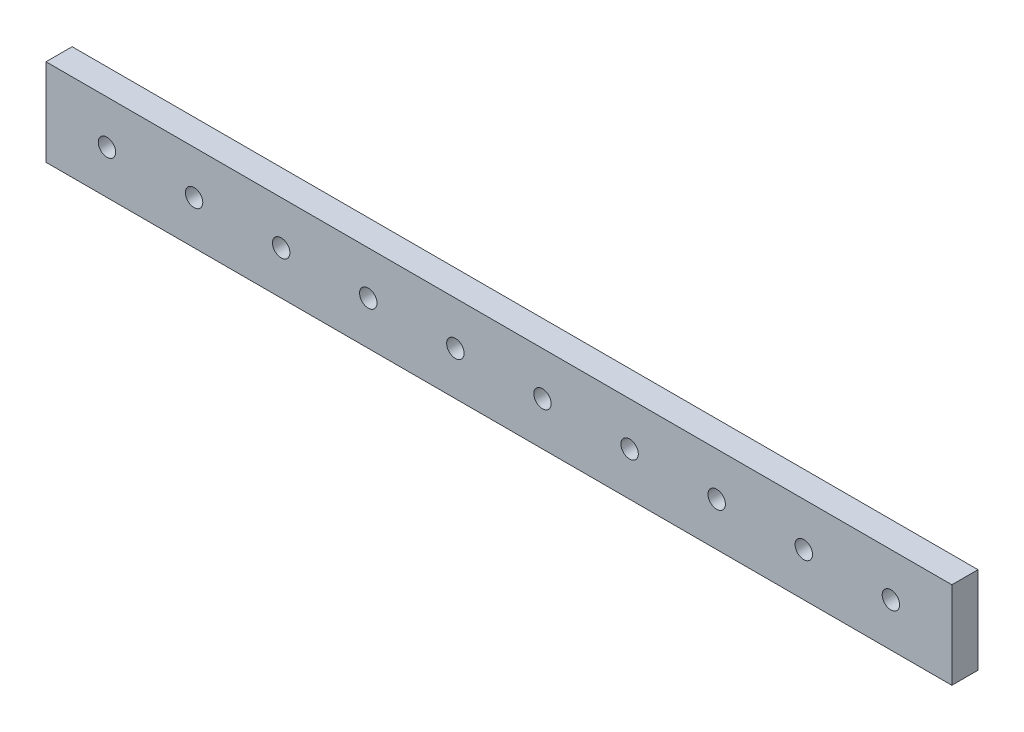
ISO-10303-21;
HEADER;
FILE_DESCRIPTION(('STEP AP214'),'2;1');
FILE_NAME('part.step','',(''),(''),'','','');
FILE_SCHEMA(('AUTOMOTIVE_DESIGN { 1 0 10303 214 1 1 1 1 }'));
ENDSEC;
DATA;
#1=APPLICATION_CONTEXT('core data for automotive mechanical design processes');
#2=APPLICATION_PROTOCOL_DEFINITION('international standard','automotive_design',2000,#1);
#3=PRODUCT_CONTEXT('',#1,'mechanical');
#4=PRODUCT('Part','Part','',(#3));
#5=PRODUCT_RELATED_PRODUCT_CATEGORY('part','',(#4));
#6=PRODUCT_DEFINITION_FORMATION('','',#4);
#7=PRODUCT_DEFINITION_CONTEXT('part definition',#1,'design');
#8=PRODUCT_DEFINITION('design','',#6,#7);
#9=PRODUCT_DEFINITION_SHAPE('','',#8);
#10=(LENGTH_UNIT() NAMED_UNIT(*) SI_UNIT(.MILLI.,.METRE.));
#11=(NAMED_UNIT(*) PLANE_ANGLE_UNIT() SI_UNIT($,.RADIAN.));
#12=(NAMED_UNIT(*) SI_UNIT($,.STERADIAN.) SOLID_ANGLE_UNIT());
#13=UNCERTAINTY_MEASURE_WITH_UNIT(LENGTH_MEASURE(1.E-05),#10,'distance_accuracy_value','');
#14=(GEOMETRIC_REPRESENTATION_CONTEXT(3) GLOBAL_UNCERTAINTY_ASSIGNED_CONTEXT((#13)) GLOBAL_UNIT_ASSIGNED_CONTEXT((#10,
#11,#12)) REPRESENTATION_CONTEXT('',''));
#15=CARTESIAN_POINT('',(0.,0.,0.));
#16=DIRECTION('',(0.,0.,1.));
#17=DIRECTION('',(1.,0.,0.));
#18=AXIS2_PLACEMENT_3D('',#15,#16,#17);
#19=CARTESIAN_POINT('',(-165.1,15.875,-88.9));
#20=DIRECTION('',(1.,0.,0.));
#21=DIRECTION('',(0.,0.,-1.));
#22=AXIS2_PLACEMENT_3D('',#19,#20,#21);
#23=PLANE('',#22);
#24=DIRECTION('',(0.,-1.,0.));
#25=VECTOR('',#24,1.);
#26=CARTESIAN_POINT('',(-165.1,15.875,-88.9));
#27=LINE('',#26,#25);
#28=CARTESIAN_POINT('',(-165.1,15.875,-88.9));
#29=VERTEX_POINT('',#28);
#30=CARTESIAN_POINT('',(-165.1,-15.875,-88.9));
#31=VERTEX_POINT('',#30);
#32=EDGE_CURVE('E190',#29,#31,#27,.T.);
#33=ORIENTED_EDGE('',*,*,#32,.T.);
#34=DIRECTION('',(0.,0.,1.));
#35=VECTOR('',#34,1.);
#36=CARTESIAN_POINT('',(-165.1,-15.875,-88.9));
#37=LINE('',#36,#35);
#38=CARTESIAN_POINT('',(-165.1,-15.875,-79.375));
#39=VERTEX_POINT('',#38);
#40=EDGE_CURVE('E172',#31,#39,#37,.T.);
#41=ORIENTED_EDGE('',*,*,#40,.T.);
#42=DIRECTION('',(0.,-1.,0.));
#43=VECTOR('',#42,1.);
#44=CARTESIAN_POINT('',(-165.1,15.875,-79.375));
#45=LINE('',#44,#43);
#46=CARTESIAN_POINT('',(-165.1,15.875,-79.375));
#47=VERTEX_POINT('',#46);
#48=EDGE_CURVE('E11',#47,#39,#45,.T.);
#49=ORIENTED_EDGE('',*,*,#48,.F.);
#50=DIRECTION('',(0.,0.,1.));
#51=VECTOR('',#50,1.);
#52=CARTESIAN_POINT('',(-165.1,15.875,-88.9));
#53=LINE('',#52,#51);
#54=EDGE_CURVE('E184',#29,#47,#53,.T.);
#55=ORIENTED_EDGE('',*,*,#54,.F.);
#56=EDGE_LOOP('',(#33,#41,#49,#55));
#57=FACE_BOUND('',#56,.T.);
#58=ADVANCED_FACE('F36',(#57),#23,.F.);
#59=CARTESIAN_POINT('',(-165.1,15.875,-79.375));
#60=DIRECTION('',(0.,0.,-1.));
#61=DIRECTION('',(-1.,0.,0.));
#62=AXIS2_PLACEMENT_3D('',#59,#60,#61);
#63=PLANE('',#62);
#64=CARTESIAN_POINT('',(-142.875,0.,-79.375));
#65=DIRECTION('',(0.,0.,1.));
#66=DIRECTION('',(1.,0.,0.));
#67=AXIS2_PLACEMENT_3D('',#64,#65,#66);
#68=CIRCLE('',#67,3.17500000000001);
#69=CARTESIAN_POINT('',(-139.7,0.,-79.375));
#70=VERTEX_POINT('',#69);
#71=EDGE_CURVE('E114',#70,#70,#68,.T.);
#72=ORIENTED_EDGE('',*,*,#71,.F.);
#73=EDGE_LOOP('',(#72));
#74=FACE_BOUND('',#73,.T.);
#75=CARTESIAN_POINT('',(-111.125,0.,-79.375));
#76=DIRECTION('',(0.,0.,1.));
#77=DIRECTION('',(1.,0.,0.));
#78=AXIS2_PLACEMENT_3D('',#75,#76,#77);
#79=CIRCLE('',#78,3.175);
#80=CARTESIAN_POINT('',(-107.95,0.,-79.375));
#81=VERTEX_POINT('',#80);
#82=EDGE_CURVE('E113',#81,#81,#79,.T.);
#83=ORIENTED_EDGE('',*,*,#82,.F.);
#84=EDGE_LOOP('',(#83));
#85=FACE_BOUND('',#84,.T.);
#86=CARTESIAN_POINT('',(-79.375,0.,-79.375));
#87=DIRECTION('',(0.,0.,1.));
#88=DIRECTION('',(1.,0.,0.));
#89=AXIS2_PLACEMENT_3D('',#86,#87,#88);
#90=CIRCLE('',#89,3.175);
#91=CARTESIAN_POINT('',(-76.2,0.,-79.375));
#92=VERTEX_POINT('',#91);
#93=EDGE_CURVE('E124',#92,#92,#90,.T.);
#94=ORIENTED_EDGE('',*,*,#93,.F.);
#95=EDGE_LOOP('',(#94));
#96=FACE_BOUND('',#95,.T.);
#97=CARTESIAN_POINT('',(-47.625,0.,-79.375));
#98=DIRECTION('',(0.,0.,1.));
#99=DIRECTION('',(1.,0.,0.));
#100=AXIS2_PLACEMENT_3D('',#97,#98,#99);
#101=CIRCLE('',#100,3.175);
#102=CARTESIAN_POINT('',(-44.45,0.,-79.375));
#103=VERTEX_POINT('',#102);
#104=EDGE_CURVE('E130',#103,#103,#101,.T.);
#105=ORIENTED_EDGE('',*,*,#104,.F.);
#106=EDGE_LOOP('',(#105));
#107=FACE_BOUND('',#106,.T.);
#108=CARTESIAN_POINT('',(-15.875,0.,-79.375));
#109=DIRECTION('',(0.,0.,1.));
#110=DIRECTION('',(1.,0.,0.));
#111=AXIS2_PLACEMENT_3D('',#108,#109,#110);
#112=CIRCLE('',#111,3.175);
#113=CARTESIAN_POINT('',(-12.7,0.,-79.375));
#114=VERTEX_POINT('',#113);
#115=EDGE_CURVE('E136',#114,#114,#112,.T.);
#116=ORIENTED_EDGE('',*,*,#115,.F.);
#117=EDGE_LOOP('',(#116));
#118=FACE_BOUND('',#117,.T.);
#119=CARTESIAN_POINT('',(15.875,0.,-79.375));
#120=DIRECTION('',(0.,0.,1.));
#121=DIRECTION('',(1.,0.,0.));
#122=AXIS2_PLACEMENT_3D('',#119,#120,#121);
#123=CIRCLE('',#122,3.175);
#124=CARTESIAN_POINT('',(19.05,0.,-79.375));
#125=VERTEX_POINT('',#124);
#126=EDGE_CURVE('E142',#125,#125,#123,.T.);
#127=ORIENTED_EDGE('',*,*,#126,.F.);
#128=EDGE_LOOP('',(#127));
#129=FACE_BOUND('',#128,.T.);
#130=CARTESIAN_POINT('',(47.625,0.,-79.375));
#131=DIRECTION('',(0.,0.,1.));
#132=DIRECTION('',(1.,0.,0.));
#133=AXIS2_PLACEMENT_3D('',#130,#131,#132);
#134=CIRCLE('',#133,3.175);
#135=CARTESIAN_POINT('',(50.8,0.,-79.375));
#136=VERTEX_POINT('',#135);
#137=EDGE_CURVE('E148',#136,#136,#134,.T.);
#138=ORIENTED_EDGE('',*,*,#137,.F.);
#139=EDGE_LOOP('',(#138));
#140=FACE_BOUND('',#139,.T.);
#141=CARTESIAN_POINT('',(79.375,0.,-79.375));
#142=DIRECTION('',(0.,0.,1.));
#143=DIRECTION('',(1.,0.,0.));
#144=AXIS2_PLACEMENT_3D('',#141,#142,#143);
#145=CIRCLE('',#144,3.175);
#146=CARTESIAN_POINT('',(82.55,0.,-79.375));
#147=VERTEX_POINT('',#146);
#148=EDGE_CURVE('E154',#147,#147,#145,.T.);
#149=ORIENTED_EDGE('',*,*,#148,.F.);
#150=EDGE_LOOP('',(#149));
#151=FACE_BOUND('',#150,.T.);
#152=CARTESIAN_POINT('',(111.125,0.,-79.375));
#153=DIRECTION('',(0.,0.,1.));
#154=DIRECTION('',(1.,0.,0.));
#155=AXIS2_PLACEMENT_3D('',#152,#153,#154);
#156=CIRCLE('',#155,3.175);
#157=CARTESIAN_POINT('',(114.3,0.,-79.375));
#158=VERTEX_POINT('',#157);
#159=EDGE_CURVE('E160',#158,#158,#156,.T.);
#160=ORIENTED_EDGE('',*,*,#159,.F.);
#161=EDGE_LOOP('',(#160));
#162=FACE_BOUND('',#161,.T.);
#163=CARTESIAN_POINT('',(142.875,0.,-79.375));
#164=DIRECTION('',(0.,0.,1.));
#165=DIRECTION('',(1.,0.,0.));
#166=AXIS2_PLACEMENT_3D('',#163,#164,#165);
#167=CIRCLE('',#166,3.17500000000001);
#168=CARTESIAN_POINT('',(146.05,0.,-79.375));
#169=VERTEX_POINT('',#168);
#170=EDGE_CURVE('E166',#169,#169,#167,.T.);
#171=ORIENTED_EDGE('',*,*,#170,.F.);
#172=EDGE_LOOP('',(#171));
#173=FACE_BOUND('',#172,.T.);
#174=ORIENTED_EDGE('',*,*,#48,.T.);
#175=DIRECTION('',(1.,0.,0.));
#176=VECTOR('',#175,1.);
#177=CARTESIAN_POINT('',(-165.1,-15.875,-79.375));
#178=LINE('',#177,#176);
#179=CARTESIAN_POINT('',(165.1,-15.875,-79.375));
#180=VERTEX_POINT('',#179);
#181=EDGE_CURVE('E175',#39,#180,#178,.T.);
#182=ORIENTED_EDGE('',*,*,#181,.T.);
#183=DIRECTION('',(0.,-1.,0.));
#184=VECTOR('',#183,1.);
#185=CARTESIAN_POINT('',(165.1,15.875,-79.375));
#186=LINE('',#185,#184);
#187=CARTESIAN_POINT('',(165.1,15.875,-79.375));
#188=VERTEX_POINT('',#187);
#189=EDGE_CURVE('E43',#188,#180,#186,.T.);
#190=ORIENTED_EDGE('',*,*,#189,.F.);
#191=DIRECTION('',(1.,0.,0.));
#192=VECTOR('',#191,1.);
#193=CARTESIAN_POINT('',(-165.1,15.875,-79.375));
#194=LINE('',#193,#192);
#195=EDGE_CURVE('E186',#47,#188,#194,.T.);
#196=ORIENTED_EDGE('',*,*,#195,.F.);
#197=EDGE_LOOP('',(#174,#182,#190,#196));
#198=FACE_BOUND('',#197,.T.);
#199=ADVANCED_FACE('F203',(#74,#85,#96,#107,#118,#129,#140,#151,#162,#173,#198),#63,.F.);
#200=CARTESIAN_POINT('',(165.1,15.875,-88.9));
#201=DIRECTION('',(-1.,0.,0.));
#202=DIRECTION('',(0.,0.,1.));
#203=AXIS2_PLACEMENT_3D('',#200,#201,#202);
#204=PLANE('',#203);
#205=ORIENTED_EDGE('',*,*,#189,.T.);
#206=DIRECTION('',(0.,0.,-1.));
#207=VECTOR('',#206,1.);
#208=CARTESIAN_POINT('',(165.1,-15.875,-88.9));
#209=LINE('',#208,#207);
#210=CARTESIAN_POINT('',(165.1,-15.875,-88.9));
#211=VERTEX_POINT('',#210);
#212=EDGE_CURVE('E178',#180,#211,#209,.T.);
#213=ORIENTED_EDGE('',*,*,#212,.T.);
#214=DIRECTION('',(0.,-1.,0.));
#215=VECTOR('',#214,1.);
#216=CARTESIAN_POINT('',(165.1,15.875,-88.9));
#217=LINE('',#216,#215);
#218=CARTESIAN_POINT('',(165.1,15.875,-88.9));
#219=VERTEX_POINT('',#218);
#220=EDGE_CURVE('E192',#219,#211,#217,.T.);
#221=ORIENTED_EDGE('',*,*,#220,.F.);
#222=DIRECTION('',(0.,0.,-1.));
#223=VECTOR('',#222,1.);
#224=CARTESIAN_POINT('',(165.1,15.875,-88.9));
#225=LINE('',#224,#223);
#226=EDGE_CURVE('E55',#188,#219,#225,.T.);
#227=ORIENTED_EDGE('',*,*,#226,.F.);
#228=EDGE_LOOP('',(#205,#213,#221,#227));
#229=FACE_BOUND('',#228,.T.);
#230=ADVANCED_FACE('F196',(#229),#204,.F.);
#231=CARTESIAN_POINT('',(-165.1,15.875,-88.9));
#232=DIRECTION('',(0.,0.,1.));
#233=DIRECTION('',(1.,0.,0.));
#234=AXIS2_PLACEMENT_3D('',#231,#232,#233);
#235=PLANE('',#234);
#236=ORIENTED_EDGE('',*,*,#220,.T.);
#237=DIRECTION('',(-1.,0.,0.));
#238=VECTOR('',#237,1.);
#239=CARTESIAN_POINT('',(-165.1,-15.875,-88.9));
#240=LINE('',#239,#238);
#241=EDGE_CURVE('E181',#211,#31,#240,.T.);
#242=ORIENTED_EDGE('',*,*,#241,.T.);
#243=ORIENTED_EDGE('',*,*,#32,.F.);
#244=DIRECTION('',(-1.,0.,0.));
#245=VECTOR('',#244,1.);
#246=CARTESIAN_POINT('',(-165.1,15.875,-88.9));
#247=LINE('',#246,#245);
#248=EDGE_CURVE('E50',#219,#29,#247,.T.);
#249=ORIENTED_EDGE('',*,*,#248,.F.);
#250=EDGE_LOOP('',(#236,#242,#243,#249));
#251=FACE_BOUND('',#250,.T.);
#252=ADVANCED_FACE('F208',(#251),#235,.F.);
#253=CARTESIAN_POINT('',(-165.1,15.875,-79.375));
#254=DIRECTION('',(0.,1.,0.));
#255=DIRECTION('',(0.,0.,1.));
#256=AXIS2_PLACEMENT_3D('',#253,#254,#255);
#257=PLANE('',#256);
#258=ORIENTED_EDGE('',*,*,#54,.T.);
#259=ORIENTED_EDGE('',*,*,#195,.T.);
#260=ORIENTED_EDGE('',*,*,#226,.T.);
#261=ORIENTED_EDGE('',*,*,#248,.T.);
#262=EDGE_LOOP('',(#258,#259,#260,#261));
#263=FACE_BOUND('',#262,.T.);
#264=ADVANCED_FACE('F210',(#263),#257,.T.);
#265=CARTESIAN_POINT('',(-165.1,-15.875,-79.375));
#266=DIRECTION('',(0.,1.,0.));
#267=DIRECTION('',(0.,0.,1.));
#268=AXIS2_PLACEMENT_3D('',#265,#266,#267);
#269=PLANE('',#268);
#270=ORIENTED_EDGE('',*,*,#40,.F.);
#271=ORIENTED_EDGE('',*,*,#241,.F.);
#272=ORIENTED_EDGE('',*,*,#212,.F.);
#273=ORIENTED_EDGE('',*,*,#181,.F.);
#274=EDGE_LOOP('',(#270,#271,#272,#273));
#275=FACE_BOUND('',#274,.T.);
#276=ADVANCED_FACE('F202',(#275),#269,.F.);
#277=CARTESIAN_POINT('',(142.875,0.,-84.1375));
#278=DIRECTION('',(0.,0.,1.));
#279=DIRECTION('',(1.,0.,0.));
#280=AXIS2_PLACEMENT_3D('',#277,#278,#279);
#281=CONICAL_SURFACE('',#280,3.17500000000001,1.02974425867666);
#282=CARTESIAN_POINT('',(142.875,0.,-86.0452324654125));
#283=VERTEX_POINT('',#282);
#284=VERTEX_LOOP('',#283);
#285=FACE_BOUND('',#284,.T.);
#286=CARTESIAN_POINT('',(142.875,0.,-84.1375));
#287=DIRECTION('',(0.,0.,1.));
#288=DIRECTION('',(1.,0.,0.));
#289=AXIS2_PLACEMENT_3D('',#286,#287,#288);
#290=CIRCLE('',#289,3.17500000000001);
#291=CARTESIAN_POINT('',(146.05,0.,-84.1375));
#292=VERTEX_POINT('',#291);
#293=EDGE_CURVE('E169',#292,#292,#290,.T.);
#294=ORIENTED_EDGE('',*,*,#293,.T.);
#295=EDGE_LOOP('',(#294));
#296=FACE_BOUND('',#295,.T.);
#297=ADVANCED_FACE('F248',(#285,#296),#281,.F.);
#298=CARTESIAN_POINT('',(142.875,0.,-79.375));
#299=DIRECTION('',(0.,0.,1.));
#300=DIRECTION('',(1.,0.,0.));
#301=AXIS2_PLACEMENT_3D('',#298,#299,#300);
#302=CYLINDRICAL_SURFACE('',#301,3.17500000000001);
#303=ORIENTED_EDGE('',*,*,#293,.F.);
#304=EDGE_LOOP('',(#303));
#305=FACE_BOUND('',#304,.T.);
#306=ORIENTED_EDGE('',*,*,#170,.T.);
#307=EDGE_LOOP('',(#306));
#308=FACE_BOUND('',#307,.T.);
#309=ADVANCED_FACE('F245',(#305,#308),#302,.F.);
#310=CARTESIAN_POINT('',(111.125,0.,-84.1375));
#311=DIRECTION('',(0.,0.,1.));
#312=DIRECTION('',(1.,0.,0.));
#313=AXIS2_PLACEMENT_3D('',#310,#311,#312);
#314=CONICAL_SURFACE('',#313,3.175,1.02974425867666);
#315=CARTESIAN_POINT('',(111.125,0.,-86.0452324654125));
#316=VERTEX_POINT('',#315);
#317=VERTEX_LOOP('',#316);
#318=FACE_BOUND('',#317,.T.);
#319=CARTESIAN_POINT('',(111.125,0.,-84.1375));
#320=DIRECTION('',(0.,0.,1.));
#321=DIRECTION('',(1.,0.,0.));
#322=AXIS2_PLACEMENT_3D('',#319,#320,#321);
#323=CIRCLE('',#322,3.175);
#324=CARTESIAN_POINT('',(114.3,0.,-84.1375));
#325=VERTEX_POINT('',#324);
#326=EDGE_CURVE('E163',#325,#325,#323,.T.);
#327=ORIENTED_EDGE('',*,*,#326,.T.);
#328=EDGE_LOOP('',(#327));
#329=FACE_BOUND('',#328,.T.);
#330=ADVANCED_FACE('F247',(#318,#329),#314,.F.);
#331=CARTESIAN_POINT('',(111.125,0.,-79.375));
#332=DIRECTION('',(0.,0.,1.));
#333=DIRECTION('',(1.,0.,0.));
#334=AXIS2_PLACEMENT_3D('',#331,#332,#333);
#335=CYLINDRICAL_SURFACE('',#334,3.175);
#336=ORIENTED_EDGE('',*,*,#326,.F.);
#337=EDGE_LOOP('',(#336));
#338=FACE_BOUND('',#337,.T.);
#339=ORIENTED_EDGE('',*,*,#159,.T.);
#340=EDGE_LOOP('',(#339));
#341=FACE_BOUND('',#340,.T.);
#342=ADVANCED_FACE('F255',(#338,#341),#335,.F.);
#343=CARTESIAN_POINT('',(79.375,0.,-84.1375));
#344=DIRECTION('',(0.,0.,1.));
#345=DIRECTION('',(1.,0.,0.));
#346=AXIS2_PLACEMENT_3D('',#343,#344,#345);
#347=CONICAL_SURFACE('',#346,3.175,1.02974425867666);
#348=CARTESIAN_POINT('',(79.375,0.,-86.0452324654125));
#349=VERTEX_POINT('',#348);
#350=VERTEX_LOOP('',#349);
#351=FACE_BOUND('',#350,.T.);
#352=CARTESIAN_POINT('',(79.375,0.,-84.1375));
#353=DIRECTION('',(0.,0.,1.));
#354=DIRECTION('',(1.,0.,0.));
#355=AXIS2_PLACEMENT_3D('',#352,#353,#354);
#356=CIRCLE('',#355,3.175);
#357=CARTESIAN_POINT('',(82.55,0.,-84.1375));
#358=VERTEX_POINT('',#357);
#359=EDGE_CURVE('E157',#358,#358,#356,.T.);
#360=ORIENTED_EDGE('',*,*,#359,.T.);
#361=EDGE_LOOP('',(#360));
#362=FACE_BOUND('',#361,.T.);
#363=ADVANCED_FACE('F293',(#351,#362),#347,.F.);
#364=CARTESIAN_POINT('',(79.375,0.,-79.375));
#365=DIRECTION('',(0.,0.,1.));
#366=DIRECTION('',(1.,0.,0.));
#367=AXIS2_PLACEMENT_3D('',#364,#365,#366);
#368=CYLINDRICAL_SURFACE('',#367,3.175);
#369=ORIENTED_EDGE('',*,*,#359,.F.);
#370=EDGE_LOOP('',(#369));
#371=FACE_BOUND('',#370,.T.);
#372=ORIENTED_EDGE('',*,*,#148,.T.);
#373=EDGE_LOOP('',(#372));
#374=FACE_BOUND('',#373,.T.);
#375=ADVANCED_FACE('F302',(#371,#374),#368,.F.);
#376=CARTESIAN_POINT('',(47.625,0.,-84.1375));
#377=DIRECTION('',(0.,0.,1.));
#378=DIRECTION('',(1.,0.,0.));
#379=AXIS2_PLACEMENT_3D('',#376,#377,#378);
#380=CONICAL_SURFACE('',#379,3.175,1.02974425867666);
#381=CARTESIAN_POINT('',(47.625,0.,-86.0452324654125));
#382=VERTEX_POINT('',#381);
#383=VERTEX_LOOP('',#382);
#384=FACE_BOUND('',#383,.T.);
#385=CARTESIAN_POINT('',(47.625,0.,-84.1375));
#386=DIRECTION('',(0.,0.,1.));
#387=DIRECTION('',(1.,0.,0.));
#388=AXIS2_PLACEMENT_3D('',#385,#386,#387);
#389=CIRCLE('',#388,3.175);
#390=CARTESIAN_POINT('',(50.8,0.,-84.1375));
#391=VERTEX_POINT('',#390);
#392=EDGE_CURVE('E151',#391,#391,#389,.T.);
#393=ORIENTED_EDGE('',*,*,#392,.T.);
#394=EDGE_LOOP('',(#393));
#395=FACE_BOUND('',#394,.T.);
#396=ADVANCED_FACE('F312',(#384,#395),#380,.F.);
#397=CARTESIAN_POINT('',(47.625,0.,-79.375));
#398=DIRECTION('',(0.,0.,1.));
#399=DIRECTION('',(1.,0.,0.));
#400=AXIS2_PLACEMENT_3D('',#397,#398,#399);
#401=CYLINDRICAL_SURFACE('',#400,3.175);
#402=ORIENTED_EDGE('',*,*,#392,.F.);
#403=EDGE_LOOP('',(#402));
#404=FACE_BOUND('',#403,.T.);
#405=ORIENTED_EDGE('',*,*,#137,.T.);
#406=EDGE_LOOP('',(#405));
#407=FACE_BOUND('',#406,.T.);
#408=ADVANCED_FACE('F322',(#404,#407),#401,.F.);
#409=CARTESIAN_POINT('',(15.875,0.,-84.1375));
#410=DIRECTION('',(0.,0.,1.));
#411=DIRECTION('',(1.,0.,0.));
#412=AXIS2_PLACEMENT_3D('',#409,#410,#411);
#413=CONICAL_SURFACE('',#412,3.175,1.02974425867666);
#414=CARTESIAN_POINT('',(15.875,0.,-86.0452324654125));
#415=VERTEX_POINT('',#414);
#416=VERTEX_LOOP('',#415);
#417=FACE_BOUND('',#416,.T.);
#418=CARTESIAN_POINT('',(15.875,0.,-84.1375));
#419=DIRECTION('',(0.,0.,1.));
#420=DIRECTION('',(1.,0.,0.));
#421=AXIS2_PLACEMENT_3D('',#418,#419,#420);
#422=CIRCLE('',#421,3.175);
#423=CARTESIAN_POINT('',(19.05,0.,-84.1375));
#424=VERTEX_POINT('',#423);
#425=EDGE_CURVE('E145',#424,#424,#422,.T.);
#426=ORIENTED_EDGE('',*,*,#425,.T.);
#427=EDGE_LOOP('',(#426));
#428=FACE_BOUND('',#427,.T.);
#429=ADVANCED_FACE('F332',(#417,#428),#413,.F.);
#430=CARTESIAN_POINT('',(15.875,0.,-79.375));
#431=DIRECTION('',(0.,0.,1.));
#432=DIRECTION('',(1.,0.,0.));
#433=AXIS2_PLACEMENT_3D('',#430,#431,#432);
#434=CYLINDRICAL_SURFACE('',#433,3.175);
#435=ORIENTED_EDGE('',*,*,#425,.F.);
#436=EDGE_LOOP('',(#435));
#437=FACE_BOUND('',#436,.T.);
#438=ORIENTED_EDGE('',*,*,#126,.T.);
#439=EDGE_LOOP('',(#438));
#440=FACE_BOUND('',#439,.T.);
#441=ADVANCED_FACE('F342',(#437,#440),#434,.F.);
#442=CARTESIAN_POINT('',(-15.875,0.,-84.1375));
#443=DIRECTION('',(0.,0.,1.));
#444=DIRECTION('',(1.,0.,0.));
#445=AXIS2_PLACEMENT_3D('',#442,#443,#444);
#446=CONICAL_SURFACE('',#445,3.175,1.02974425867666);
#447=CARTESIAN_POINT('',(-15.875,0.,-86.0452324654125));
#448=VERTEX_POINT('',#447);
#449=VERTEX_LOOP('',#448);
#450=FACE_BOUND('',#449,.T.);
#451=CARTESIAN_POINT('',(-15.875,0.,-84.1375));
#452=DIRECTION('',(0.,0.,1.));
#453=DIRECTION('',(1.,0.,0.));
#454=AXIS2_PLACEMENT_3D('',#451,#452,#453);
#455=CIRCLE('',#454,3.175);
#456=CARTESIAN_POINT('',(-12.7,0.,-84.1375));
#457=VERTEX_POINT('',#456);
#458=EDGE_CURVE('E139',#457,#457,#455,.T.);
#459=ORIENTED_EDGE('',*,*,#458,.T.);
#460=EDGE_LOOP('',(#459));
#461=FACE_BOUND('',#460,.T.);
#462=ADVANCED_FACE('F352',(#450,#461),#446,.F.);
#463=CARTESIAN_POINT('',(-15.875,0.,-79.375));
#464=DIRECTION('',(0.,0.,1.));
#465=DIRECTION('',(1.,0.,0.));
#466=AXIS2_PLACEMENT_3D('',#463,#464,#465);
#467=CYLINDRICAL_SURFACE('',#466,3.175);
#468=ORIENTED_EDGE('',*,*,#458,.F.);
#469=EDGE_LOOP('',(#468));
#470=FACE_BOUND('',#469,.T.);
#471=ORIENTED_EDGE('',*,*,#115,.T.);
#472=EDGE_LOOP('',(#471));
#473=FACE_BOUND('',#472,.T.);
#474=ADVANCED_FACE('F362',(#470,#473),#467,.F.);
#475=CARTESIAN_POINT('',(-47.625,0.,-84.1375));
#476=DIRECTION('',(0.,0.,1.));
#477=DIRECTION('',(1.,0.,0.));
#478=AXIS2_PLACEMENT_3D('',#475,#476,#477);
#479=CONICAL_SURFACE('',#478,3.175,1.02974425867666);
#480=CARTESIAN_POINT('',(-47.625,0.,-86.0452324654125));
#481=VERTEX_POINT('',#480);
#482=VERTEX_LOOP('',#481);
#483=FACE_BOUND('',#482,.T.);
#484=CARTESIAN_POINT('',(-47.625,0.,-84.1375));
#485=DIRECTION('',(0.,0.,1.));
#486=DIRECTION('',(1.,0.,0.));
#487=AXIS2_PLACEMENT_3D('',#484,#485,#486);
#488=CIRCLE('',#487,3.175);
#489=CARTESIAN_POINT('',(-44.45,0.,-84.1375));
#490=VERTEX_POINT('',#489);
#491=EDGE_CURVE('E133',#490,#490,#488,.T.);
#492=ORIENTED_EDGE('',*,*,#491,.T.);
#493=EDGE_LOOP('',(#492));
#494=FACE_BOUND('',#493,.T.);
#495=ADVANCED_FACE('F372',(#483,#494),#479,.F.);
#496=CARTESIAN_POINT('',(-47.625,0.,-79.375));
#497=DIRECTION('',(0.,0.,1.));
#498=DIRECTION('',(1.,0.,0.));
#499=AXIS2_PLACEMENT_3D('',#496,#497,#498);
#500=CYLINDRICAL_SURFACE('',#499,3.175);
#501=ORIENTED_EDGE('',*,*,#491,.F.);
#502=EDGE_LOOP('',(#501));
#503=FACE_BOUND('',#502,.T.);
#504=ORIENTED_EDGE('',*,*,#104,.T.);
#505=EDGE_LOOP('',(#504));
#506=FACE_BOUND('',#505,.T.);
#507=ADVANCED_FACE('F382',(#503,#506),#500,.F.);
#508=CARTESIAN_POINT('',(-79.375,0.,-84.1375));
#509=DIRECTION('',(0.,0.,1.));
#510=DIRECTION('',(1.,0.,0.));
#511=AXIS2_PLACEMENT_3D('',#508,#509,#510);
#512=CONICAL_SURFACE('',#511,3.175,1.02974425867666);
#513=CARTESIAN_POINT('',(-79.375,0.,-86.0452324654125));
#514=VERTEX_POINT('',#513);
#515=VERTEX_LOOP('',#514);
#516=FACE_BOUND('',#515,.T.);
#517=CARTESIAN_POINT('',(-79.375,0.,-84.1375));
#518=DIRECTION('',(0.,0.,1.));
#519=DIRECTION('',(1.,0.,0.));
#520=AXIS2_PLACEMENT_3D('',#517,#518,#519);
#521=CIRCLE('',#520,3.175);
#522=CARTESIAN_POINT('',(-76.2,0.,-84.1375));
#523=VERTEX_POINT('',#522);
#524=EDGE_CURVE('E127',#523,#523,#521,.T.);
#525=ORIENTED_EDGE('',*,*,#524,.T.);
#526=EDGE_LOOP('',(#525));
#527=FACE_BOUND('',#526,.T.);
#528=ADVANCED_FACE('F392',(#516,#527),#512,.F.);
#529=CARTESIAN_POINT('',(-79.375,0.,-79.375));
#530=DIRECTION('',(0.,0.,1.));
#531=DIRECTION('',(1.,0.,0.));
#532=AXIS2_PLACEMENT_3D('',#529,#530,#531);
#533=CYLINDRICAL_SURFACE('',#532,3.175);
#534=ORIENTED_EDGE('',*,*,#524,.F.);
#535=EDGE_LOOP('',(#534));
#536=FACE_BOUND('',#535,.T.);
#537=ORIENTED_EDGE('',*,*,#93,.T.);
#538=EDGE_LOOP('',(#537));
#539=FACE_BOUND('',#538,.T.);
#540=ADVANCED_FACE('F402',(#536,#539),#533,.F.);
#541=CARTESIAN_POINT('',(-111.125,0.,-84.1375));
#542=DIRECTION('',(0.,0.,1.));
#543=DIRECTION('',(1.,0.,0.));
#544=AXIS2_PLACEMENT_3D('',#541,#542,#543);
#545=CONICAL_SURFACE('',#544,3.175,1.02974425867666);
#546=CARTESIAN_POINT('',(-111.125,0.,-86.0452324654125));
#547=VERTEX_POINT('',#546);
#548=VERTEX_LOOP('',#547);
#549=FACE_BOUND('',#548,.T.);
#550=CARTESIAN_POINT('',(-111.125,0.,-84.1375));
#551=DIRECTION('',(0.,0.,1.));
#552=DIRECTION('',(1.,0.,0.));
#553=AXIS2_PLACEMENT_3D('',#550,#551,#552);
#554=CIRCLE('',#553,3.175);
#555=CARTESIAN_POINT('',(-107.95,0.,-84.1375));
#556=VERTEX_POINT('',#555);
#557=EDGE_CURVE('E117',#556,#556,#554,.T.);
#558=ORIENTED_EDGE('',*,*,#557,.T.);
#559=EDGE_LOOP('',(#558));
#560=FACE_BOUND('',#559,.T.);
#561=ADVANCED_FACE('F412',(#549,#560),#545,.F.);
#562=CARTESIAN_POINT('',(-111.125,0.,-79.375));
#563=DIRECTION('',(0.,0.,1.));
#564=DIRECTION('',(1.,0.,0.));
#565=AXIS2_PLACEMENT_3D('',#562,#563,#564);
#566=CYLINDRICAL_SURFACE('',#565,3.175);
#567=ORIENTED_EDGE('',*,*,#557,.F.);
#568=EDGE_LOOP('',(#567));
#569=FACE_BOUND('',#568,.T.);
#570=ORIENTED_EDGE('',*,*,#82,.T.);
#571=EDGE_LOOP('',(#570));
#572=FACE_BOUND('',#571,.T.);
#573=ADVANCED_FACE('F107',(#569,#572),#566,.F.);
#574=CARTESIAN_POINT('',(-142.875,0.,-84.1375));
#575=DIRECTION('',(0.,0.,1.));
#576=DIRECTION('',(1.,0.,0.));
#577=AXIS2_PLACEMENT_3D('',#574,#575,#576);
#578=CONICAL_SURFACE('',#577,3.17500000000001,1.02974425867666);
#579=CARTESIAN_POINT('',(-142.875,0.,-86.0452324654125));
#580=VERTEX_POINT('',#579);
#581=VERTEX_LOOP('',#580);
#582=FACE_BOUND('',#581,.T.);
#583=CARTESIAN_POINT('',(-142.875,0.,-84.1375));
#584=DIRECTION('',(0.,0.,1.));
#585=DIRECTION('',(1.,0.,0.));
#586=AXIS2_PLACEMENT_3D('',#583,#584,#585);
#587=CIRCLE('',#586,3.17500000000001);
#588=CARTESIAN_POINT('',(-139.7,0.,-84.1375));
#589=VERTEX_POINT('',#588);
#590=EDGE_CURVE('E111',#589,#589,#587,.T.);
#591=ORIENTED_EDGE('',*,*,#590,.T.);
#592=EDGE_LOOP('',(#591));
#593=FACE_BOUND('',#592,.T.);
#594=ADVANCED_FACE('F103',(#582,#593),#578,.F.);
#595=CARTESIAN_POINT('',(-142.875,0.,-79.375));
#596=DIRECTION('',(0.,0.,1.));
#597=DIRECTION('',(1.,0.,0.));
#598=AXIS2_PLACEMENT_3D('',#595,#596,#597);
#599=CYLINDRICAL_SURFACE('',#598,3.17500000000001);
#600=ORIENTED_EDGE('',*,*,#590,.F.);
#601=EDGE_LOOP('',(#600));
#602=FACE_BOUND('',#601,.T.);
#603=ORIENTED_EDGE('',*,*,#71,.T.);
#604=EDGE_LOOP('',(#603));
#605=FACE_BOUND('',#604,.T.);
#606=ADVANCED_FACE('F106',(#602,#605),#599,.F.);
#607=CLOSED_SHELL('',(#58,#199,#230,#252,#264,#276,#297,#309,#330,#342,#363,#375,#396,#408,#429,
#441,#462,#474,#495,#507,#528,#540,#561,#573,#594,#606));
#608=MANIFOLD_SOLID_BREP('B2',#607);
#609=ADVANCED_BREP_SHAPE_REPRESENTATION('',(#18,#608),#14);
#610=SHAPE_DEFINITION_REPRESENTATION(#9,#609);
ENDSEC;
END-ISO-10303-21;
